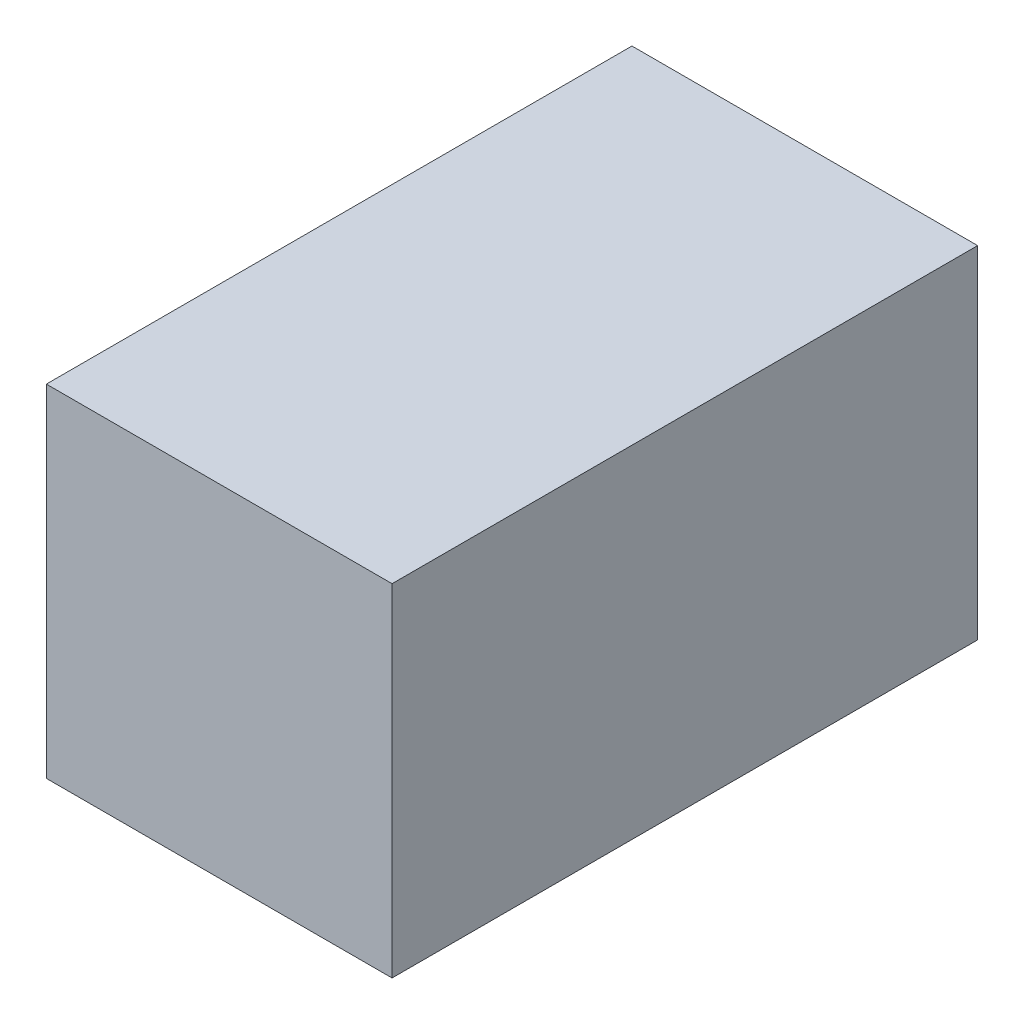
ISO-10303-21;
HEADER;
FILE_DESCRIPTION(('STEP AP214'),'2;1');
FILE_NAME('part.step','',(''),(''),'','','');
FILE_SCHEMA(('AUTOMOTIVE_DESIGN { 1 0 10303 214 1 1 1 1 }'));
ENDSEC;
DATA;
#1=APPLICATION_CONTEXT('core data for automotive mechanical design processes');
#2=APPLICATION_PROTOCOL_DEFINITION('international standard','automotive_design',2000,#1);
#3=PRODUCT_CONTEXT('',#1,'mechanical');
#4=PRODUCT('Part','Part','',(#3));
#5=PRODUCT_RELATED_PRODUCT_CATEGORY('part','',(#4));
#6=PRODUCT_DEFINITION_FORMATION('','',#4);
#7=PRODUCT_DEFINITION_CONTEXT('part definition',#1,'design');
#8=PRODUCT_DEFINITION('design','',#6,#7);
#9=PRODUCT_DEFINITION_SHAPE('','',#8);
#10=(LENGTH_UNIT() NAMED_UNIT(*) SI_UNIT(.MILLI.,.METRE.));
#11=(NAMED_UNIT(*) PLANE_ANGLE_UNIT() SI_UNIT($,.RADIAN.));
#12=(NAMED_UNIT(*) SI_UNIT($,.STERADIAN.) SOLID_ANGLE_UNIT());
#13=UNCERTAINTY_MEASURE_WITH_UNIT(LENGTH_MEASURE(1.E-05),#10,'distance_accuracy_value','');
#14=(GEOMETRIC_REPRESENTATION_CONTEXT(3) GLOBAL_UNCERTAINTY_ASSIGNED_CONTEXT((#13)) GLOBAL_UNIT_ASSIGNED_CONTEXT((#10,
#11,#12)) REPRESENTATION_CONTEXT('',''));
#15=CARTESIAN_POINT('',(0.,0.,0.));
#16=DIRECTION('',(0.,0.,1.));
#17=DIRECTION('',(1.,0.,0.));
#18=AXIS2_PLACEMENT_3D('',#15,#16,#17);
#19=CARTESIAN_POINT('',(36.5125,36.068,123.698));
#20=DIRECTION('',(-1.,0.,0.));
#21=DIRECTION('',(0.,-1.,0.));
#22=AXIS2_PLACEMENT_3D('',#19,#20,#21);
#23=PLANE('',#22);
#24=DIRECTION('',(0.,1.,0.));
#25=VECTOR('',#24,1.);
#26=CARTESIAN_POINT('',(36.5125,36.068,0.));
#27=LINE('',#26,#25);
#28=CARTESIAN_POINT('',(36.5125,-36.068,0.));
#29=VERTEX_POINT('',#28);
#30=CARTESIAN_POINT('',(36.5125,36.068,0.));
#31=VERTEX_POINT('',#30);
#32=EDGE_CURVE('E104',#29,#31,#27,.T.);
#33=ORIENTED_EDGE('',*,*,#32,.T.);
#34=DIRECTION('',(0.,0.,-1.));
#35=VECTOR('',#34,1.);
#36=CARTESIAN_POINT('',(36.5125,36.068,123.698));
#37=LINE('',#36,#35);
#38=CARTESIAN_POINT('',(36.5125,36.068,123.698));
#39=VERTEX_POINT('',#38);
#40=EDGE_CURVE('E11',#39,#31,#37,.T.);
#41=ORIENTED_EDGE('',*,*,#40,.F.);
#42=DIRECTION('',(0.,1.,0.));
#43=VECTOR('',#42,1.);
#44=CARTESIAN_POINT('',(36.5125,36.068,123.698));
#45=LINE('',#44,#43);
#46=CARTESIAN_POINT('',(36.5125,-36.068,123.698));
#47=VERTEX_POINT('',#46);
#48=EDGE_CURVE('E92',#47,#39,#45,.T.);
#49=ORIENTED_EDGE('',*,*,#48,.F.);
#50=DIRECTION('',(0.,0.,-1.));
#51=VECTOR('',#50,1.);
#52=CARTESIAN_POINT('',(36.5125,-36.068,123.698));
#53=LINE('',#52,#51);
#54=EDGE_CURVE('E100',#47,#29,#53,.T.);
#55=ORIENTED_EDGE('',*,*,#54,.T.);
#56=EDGE_LOOP('',(#33,#41,#49,#55));
#57=FACE_BOUND('',#56,.T.);
#58=ADVANCED_FACE('F41',(#57),#23,.F.);
#59=CARTESIAN_POINT('',(-36.5125,36.068,123.698));
#60=DIRECTION('',(0.,-1.,0.));
#61=DIRECTION('',(0.,0.,-1.));
#62=AXIS2_PLACEMENT_3D('',#59,#60,#61);
#63=PLANE('',#62);
#64=DIRECTION('',(-1.,0.,0.));
#65=VECTOR('',#64,1.);
#66=CARTESIAN_POINT('',(-36.5125,36.068,0.));
#67=LINE('',#66,#65);
#68=CARTESIAN_POINT('',(-36.5125,36.068,0.));
#69=VERTEX_POINT('',#68);
#70=EDGE_CURVE('E96',#31,#69,#67,.T.);
#71=ORIENTED_EDGE('',*,*,#70,.T.);
#72=DIRECTION('',(0.,0.,-1.));
#73=VECTOR('',#72,1.);
#74=CARTESIAN_POINT('',(-36.5125,36.068,123.698));
#75=LINE('',#74,#73);
#76=CARTESIAN_POINT('',(-36.5125,36.068,123.698));
#77=VERTEX_POINT('',#76);
#78=EDGE_CURVE('E49',#77,#69,#75,.T.);
#79=ORIENTED_EDGE('',*,*,#78,.F.);
#80=DIRECTION('',(-1.,0.,0.));
#81=VECTOR('',#80,1.);
#82=CARTESIAN_POINT('',(-36.5125,36.068,123.698));
#83=LINE('',#82,#81);
#84=EDGE_CURVE('E87',#39,#77,#83,.T.);
#85=ORIENTED_EDGE('',*,*,#84,.F.);
#86=ORIENTED_EDGE('',*,*,#40,.T.);
#87=EDGE_LOOP('',(#71,#79,#85,#86));
#88=FACE_BOUND('',#87,.T.);
#89=ADVANCED_FACE('F95',(#88),#63,.F.);
#90=CARTESIAN_POINT('',(-36.5125,36.068,123.698));
#91=DIRECTION('',(1.,0.,0.));
#92=DIRECTION('',(0.,1.,0.));
#93=AXIS2_PLACEMENT_3D('',#90,#91,#92);
#94=PLANE('',#93);
#95=DIRECTION('',(0.,-1.,0.));
#96=VECTOR('',#95,1.);
#97=CARTESIAN_POINT('',(-36.5125,36.068,0.));
#98=LINE('',#97,#96);
#99=CARTESIAN_POINT('',(-36.5125,-36.068,0.));
#100=VERTEX_POINT('',#99);
#101=EDGE_CURVE('E74',#69,#100,#98,.T.);
#102=ORIENTED_EDGE('',*,*,#101,.T.);
#103=DIRECTION('',(0.,0.,-1.));
#104=VECTOR('',#103,1.);
#105=CARTESIAN_POINT('',(-36.5125,-36.068,123.698));
#106=LINE('',#105,#104);
#107=CARTESIAN_POINT('',(-36.5125,-36.068,123.698));
#108=VERTEX_POINT('',#107);
#109=EDGE_CURVE('E97',#108,#100,#106,.T.);
#110=ORIENTED_EDGE('',*,*,#109,.F.);
#111=DIRECTION('',(0.,-1.,0.));
#112=VECTOR('',#111,1.);
#113=CARTESIAN_POINT('',(-36.5125,36.068,123.698));
#114=LINE('',#113,#112);
#115=EDGE_CURVE('E90',#77,#108,#114,.T.);
#116=ORIENTED_EDGE('',*,*,#115,.F.);
#117=ORIENTED_EDGE('',*,*,#78,.T.);
#118=EDGE_LOOP('',(#102,#110,#116,#117));
#119=FACE_BOUND('',#118,.T.);
#120=ADVANCED_FACE('F98',(#119),#94,.F.);
#121=CARTESIAN_POINT('',(-36.5125,-36.068,123.698));
#122=DIRECTION('',(0.,1.,0.));
#123=DIRECTION('',(0.,0.,1.));
#124=AXIS2_PLACEMENT_3D('',#121,#122,#123);
#125=PLANE('',#124);
#126=DIRECTION('',(1.,0.,0.));
#127=VECTOR('',#126,1.);
#128=CARTESIAN_POINT('',(-36.5125,-36.068,0.));
#129=LINE('',#128,#127);
#130=EDGE_CURVE('E80',#100,#29,#129,.T.);
#131=ORIENTED_EDGE('',*,*,#130,.T.);
#132=ORIENTED_EDGE('',*,*,#54,.F.);
#133=DIRECTION('',(1.,0.,0.));
#134=VECTOR('',#133,1.);
#135=CARTESIAN_POINT('',(-36.5125,-36.068,123.698));
#136=LINE('',#135,#134);
#137=EDGE_CURVE('E57',#108,#47,#136,.T.);
#138=ORIENTED_EDGE('',*,*,#137,.F.);
#139=ORIENTED_EDGE('',*,*,#109,.T.);
#140=EDGE_LOOP('',(#131,#132,#138,#139));
#141=FACE_BOUND('',#140,.T.);
#142=ADVANCED_FACE('F111',(#141),#125,.F.);
#143=CARTESIAN_POINT('',(0.,0.,123.698));
#144=DIRECTION('',(0.,0.,1.));
#145=DIRECTION('',(1.,0.,0.));
#146=AXIS2_PLACEMENT_3D('',#143,#144,#145);
#147=PLANE('',#146);
#148=ORIENTED_EDGE('',*,*,#48,.T.);
#149=ORIENTED_EDGE('',*,*,#84,.T.);
#150=ORIENTED_EDGE('',*,*,#115,.T.);
#151=ORIENTED_EDGE('',*,*,#137,.T.);
#152=EDGE_LOOP('',(#148,#149,#150,#151));
#153=FACE_BOUND('',#152,.T.);
#154=ADVANCED_FACE('F88',(#153),#147,.T.);
#155=CARTESIAN_POINT('',(0.,0.,0.));
#156=DIRECTION('',(0.,0.,1.));
#157=DIRECTION('',(1.,0.,0.));
#158=AXIS2_PLACEMENT_3D('',#155,#156,#157);
#159=PLANE('',#158);
#160=ORIENTED_EDGE('',*,*,#32,.F.);
#161=ORIENTED_EDGE('',*,*,#130,.F.);
#162=ORIENTED_EDGE('',*,*,#101,.F.);
#163=ORIENTED_EDGE('',*,*,#70,.F.);
#164=EDGE_LOOP('',(#160,#161,#162,#163));
#165=FACE_BOUND('',#164,.T.);
#166=ADVANCED_FACE('F114',(#165),#159,.F.);
#167=CLOSED_SHELL('',(#58,#89,#120,#142,#154,#166));
#168=MANIFOLD_SOLID_BREP('B2',#167);
#169=ADVANCED_BREP_SHAPE_REPRESENTATION('',(#18,#168),#14);
#170=SHAPE_DEFINITION_REPRESENTATION(#9,#169);
ENDSEC;
END-ISO-10303-21;
